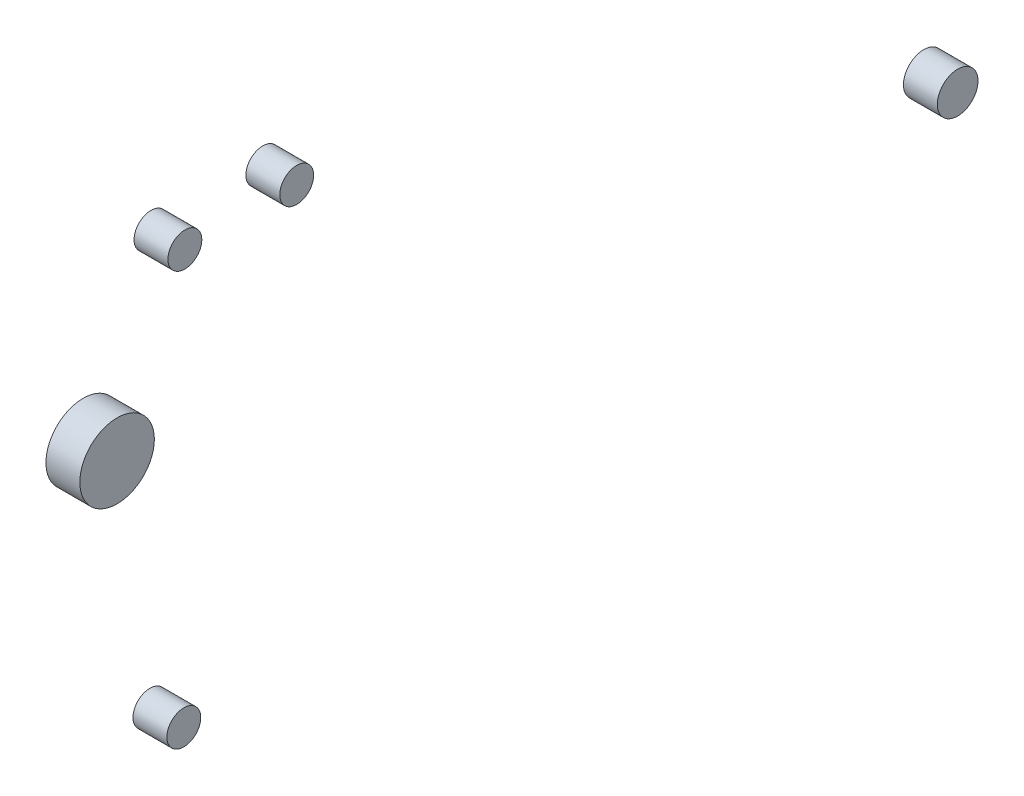
ISO-10303-21;
HEADER;
FILE_DESCRIPTION(('STEP AP214'),'2;1');
FILE_NAME('part.step','',(''),(''),'','','');
FILE_SCHEMA(('AUTOMOTIVE_DESIGN { 1 0 10303 214 1 1 1 1 }'));
ENDSEC;
DATA;
#1=APPLICATION_CONTEXT('core data for automotive mechanical design processes');
#2=APPLICATION_PROTOCOL_DEFINITION('international standard','automotive_design',2000,#1);
#3=PRODUCT_CONTEXT('',#1,'mechanical');
#4=PRODUCT('Part','Part','',(#3));
#5=PRODUCT_RELATED_PRODUCT_CATEGORY('part','',(#4));
#6=PRODUCT_DEFINITION_FORMATION('','',#4);
#7=PRODUCT_DEFINITION_CONTEXT('part definition',#1,'design');
#8=PRODUCT_DEFINITION('design','',#6,#7);
#9=PRODUCT_DEFINITION_SHAPE('','',#8);
#10=(LENGTH_UNIT() NAMED_UNIT(*) SI_UNIT(.MILLI.,.METRE.));
#11=(NAMED_UNIT(*) PLANE_ANGLE_UNIT() SI_UNIT($,.RADIAN.));
#12=(NAMED_UNIT(*) SI_UNIT($,.STERADIAN.) SOLID_ANGLE_UNIT());
#13=UNCERTAINTY_MEASURE_WITH_UNIT(LENGTH_MEASURE(1.E-05),#10,'distance_accuracy_value','');
#14=(GEOMETRIC_REPRESENTATION_CONTEXT(3) GLOBAL_UNCERTAINTY_ASSIGNED_CONTEXT((#13)) GLOBAL_UNIT_ASSIGNED_CONTEXT((#10,
#11,#12)) REPRESENTATION_CONTEXT('',''));
#15=CARTESIAN_POINT('',(0.,0.,0.));
#16=DIRECTION('',(0.,0.,1.));
#17=DIRECTION('',(1.,0.,0.));
#18=AXIS2_PLACEMENT_3D('',#15,#16,#17);
#19=CARTESIAN_POINT('',(2.54,30.976,-8.462));
#20=DIRECTION('',(-1.,0.,0.));
#21=DIRECTION('',(0.,0.,1.));
#22=AXIS2_PLACEMENT_3D('',#19,#20,#21);
#23=CYLINDRICAL_SURFACE('',#22,1.27);
#24=CARTESIAN_POINT('',(2.54,30.976,-8.462));
#25=DIRECTION('',(1.,0.,0.));
#26=DIRECTION('',(0.,0.,-1.));
#27=AXIS2_PLACEMENT_3D('',#24,#25,#26);
#28=CIRCLE('',#27,1.27);
#29=CARTESIAN_POINT('',(2.54,30.976,-9.732));
#30=VERTEX_POINT('',#29);
#31=EDGE_CURVE('E11',#30,#30,#28,.T.);
#32=ORIENTED_EDGE('',*,*,#31,.F.);
#33=EDGE_LOOP('',(#32));
#34=FACE_BOUND('',#33,.T.);
#35=CARTESIAN_POINT('',(0.,30.976,-8.462));
#36=DIRECTION('',(1.,0.,0.));
#37=DIRECTION('',(0.,0.,-1.));
#38=AXIS2_PLACEMENT_3D('',#35,#36,#37);
#39=CIRCLE('',#38,1.27);
#40=CARTESIAN_POINT('',(0.,30.976,-9.732));
#41=VERTEX_POINT('',#40);
#42=EDGE_CURVE('E43',#41,#41,#39,.T.);
#43=ORIENTED_EDGE('',*,*,#42,.T.);
#44=EDGE_LOOP('',(#43));
#45=FACE_BOUND('',#44,.T.);
#46=ADVANCED_FACE('F40',(#34,#45),#23,.T.);
#47=CARTESIAN_POINT('',(2.54,30.976,-8.462));
#48=DIRECTION('',(1.,0.,0.));
#49=DIRECTION('',(0.,0.,-1.));
#50=AXIS2_PLACEMENT_3D('',#47,#48,#49);
#51=PLANE('',#50);
#52=ORIENTED_EDGE('',*,*,#31,.T.);
#53=EDGE_LOOP('',(#52));
#54=FACE_BOUND('',#53,.T.);
#55=ADVANCED_FACE('F55',(#54),#51,.T.);
#56=CARTESIAN_POINT('',(0.,30.976,-8.462));
#57=DIRECTION('',(1.,0.,0.));
#58=DIRECTION('',(0.,0.,-1.));
#59=AXIS2_PLACEMENT_3D('',#56,#57,#58);
#60=PLANE('',#59);
#61=ORIENTED_EDGE('',*,*,#42,.F.);
#62=EDGE_LOOP('',(#61));
#63=FACE_BOUND('',#62,.T.);
#64=ADVANCED_FACE('F53',(#63),#60,.F.);
#65=CLOSED_SHELL('',(#46,#55,#64));
#66=MANIFOLD_SOLID_BREP('B2',#65);
#67=CARTESIAN_POINT('',(2.54,30.976,-0.0799999999999967));
#68=DIRECTION('',(-1.,0.,0.));
#69=DIRECTION('',(0.,0.,1.));
#70=AXIS2_PLACEMENT_3D('',#67,#68,#69);
#71=CYLINDRICAL_SURFACE('',#70,1.27);
#72=CARTESIAN_POINT('',(2.54,30.976,-0.0799999999999967));
#73=DIRECTION('',(1.,0.,0.));
#74=DIRECTION('',(0.,0.,-1.));
#75=AXIS2_PLACEMENT_3D('',#72,#73,#74);
#76=CIRCLE('',#75,1.27);
#77=CARTESIAN_POINT('',(2.54,30.976,-1.35));
#78=VERTEX_POINT('',#77);
#79=EDGE_CURVE('E39',#78,#78,#76,.T.);
#80=ORIENTED_EDGE('',*,*,#79,.F.);
#81=EDGE_LOOP('',(#80));
#82=FACE_BOUND('',#81,.T.);
#83=CARTESIAN_POINT('',(0.,30.976,-0.0799999999999967));
#84=DIRECTION('',(1.,0.,0.));
#85=DIRECTION('',(0.,0.,-1.));
#86=AXIS2_PLACEMENT_3D('',#83,#84,#85);
#87=CIRCLE('',#86,1.27);
#88=CARTESIAN_POINT('',(0.,30.976,-1.35));
#89=VERTEX_POINT('',#88);
#90=EDGE_CURVE('E92',#89,#89,#87,.T.);
#91=ORIENTED_EDGE('',*,*,#90,.T.);
#92=EDGE_LOOP('',(#91));
#93=FACE_BOUND('',#92,.T.);
#94=ADVANCED_FACE('F89',(#82,#93),#71,.T.);
#95=CARTESIAN_POINT('',(2.54,30.976,-0.0799999999999967));
#96=DIRECTION('',(1.,0.,0.));
#97=DIRECTION('',(0.,0.,-1.));
#98=AXIS2_PLACEMENT_3D('',#95,#96,#97);
#99=PLANE('',#98);
#100=ORIENTED_EDGE('',*,*,#79,.T.);
#101=EDGE_LOOP('',(#100));
#102=FACE_BOUND('',#101,.T.);
#103=ADVANCED_FACE('F104',(#102),#99,.T.);
#104=CARTESIAN_POINT('',(0.,30.976,-0.0799999999999967));
#105=DIRECTION('',(1.,0.,0.));
#106=DIRECTION('',(0.,0.,-1.));
#107=AXIS2_PLACEMENT_3D('',#104,#105,#106);
#108=PLANE('',#107);
#109=ORIENTED_EDGE('',*,*,#90,.F.);
#110=EDGE_LOOP('',(#109));
#111=FACE_BOUND('',#110,.T.);
#112=ADVANCED_FACE('F102',(#111),#108,.F.);
#113=CLOSED_SHELL('',(#94,#103,#112));
#114=MANIFOLD_SOLID_BREP('B6',#113);
#115=CARTESIAN_POINT('',(2.54,12.2,-58.));
#116=DIRECTION('',(-1.,0.,0.));
#117=DIRECTION('',(0.,0.,1.));
#118=AXIS2_PLACEMENT_3D('',#115,#116,#117);
#119=CYLINDRICAL_SURFACE('',#118,1.524);
#120=CARTESIAN_POINT('',(2.54,12.2,-58.));
#121=DIRECTION('',(1.,0.,0.));
#122=DIRECTION('',(0.,0.,-1.));
#123=AXIS2_PLACEMENT_3D('',#120,#121,#122);
#124=CIRCLE('',#123,1.524);
#125=CARTESIAN_POINT('',(2.54,12.2,-59.524));
#126=VERTEX_POINT('',#125);
#127=EDGE_CURVE('E88',#126,#126,#124,.T.);
#128=ORIENTED_EDGE('',*,*,#127,.F.);
#129=EDGE_LOOP('',(#128));
#130=FACE_BOUND('',#129,.T.);
#131=CARTESIAN_POINT('',(0.,12.2,-58.));
#132=DIRECTION('',(1.,0.,0.));
#133=DIRECTION('',(0.,0.,-1.));
#134=AXIS2_PLACEMENT_3D('',#131,#132,#133);
#135=CIRCLE('',#134,1.524);
#136=CARTESIAN_POINT('',(0.,12.2,-59.524));
#137=VERTEX_POINT('',#136);
#138=EDGE_CURVE('E141',#137,#137,#135,.T.);
#139=ORIENTED_EDGE('',*,*,#138,.T.);
#140=EDGE_LOOP('',(#139));
#141=FACE_BOUND('',#140,.T.);
#142=ADVANCED_FACE('F138',(#130,#141),#119,.T.);
#143=CARTESIAN_POINT('',(2.54,12.2,-58.));
#144=DIRECTION('',(1.,0.,0.));
#145=DIRECTION('',(0.,0.,-1.));
#146=AXIS2_PLACEMENT_3D('',#143,#144,#145);
#147=PLANE('',#146);
#148=ORIENTED_EDGE('',*,*,#127,.T.);
#149=EDGE_LOOP('',(#148));
#150=FACE_BOUND('',#149,.T.);
#151=ADVANCED_FACE('F153',(#150),#147,.T.);
#152=CARTESIAN_POINT('',(0.,12.2,-58.));
#153=DIRECTION('',(1.,0.,0.));
#154=DIRECTION('',(0.,0.,-1.));
#155=AXIS2_PLACEMENT_3D('',#152,#153,#154);
#156=PLANE('',#155);
#157=ORIENTED_EDGE('',*,*,#138,.F.);
#158=EDGE_LOOP('',(#157));
#159=FACE_BOUND('',#158,.T.);
#160=ADVANCED_FACE('F151',(#159),#156,.F.);
#161=CLOSED_SHELL('',(#142,#151,#160));
#162=MANIFOLD_SOLID_BREP('B34',#161);
#163=CARTESIAN_POINT('',(2.54,19.8,5.));
#164=DIRECTION('',(-1.,0.,0.));
#165=DIRECTION('',(0.,0.,1.));
#166=AXIS2_PLACEMENT_3D('',#163,#164,#165);
#167=CYLINDRICAL_SURFACE('',#166,2.794);
#168=CARTESIAN_POINT('',(2.54,19.8,5.));
#169=DIRECTION('',(1.,0.,0.));
#170=DIRECTION('',(0.,0.,-1.));
#171=AXIS2_PLACEMENT_3D('',#168,#169,#170);
#172=CIRCLE('',#171,2.794);
#173=CARTESIAN_POINT('',(2.54,19.8,2.20599999999999));
#174=VERTEX_POINT('',#173);
#175=EDGE_CURVE('E137',#174,#174,#172,.T.);
#176=ORIENTED_EDGE('',*,*,#175,.F.);
#177=EDGE_LOOP('',(#176));
#178=FACE_BOUND('',#177,.T.);
#179=CARTESIAN_POINT('',(0.,19.8,5.));
#180=DIRECTION('',(1.,0.,0.));
#181=DIRECTION('',(0.,0.,-1.));
#182=AXIS2_PLACEMENT_3D('',#179,#180,#181);
#183=CIRCLE('',#182,2.794);
#184=CARTESIAN_POINT('',(0.,19.8,2.20599999999999));
#185=VERTEX_POINT('',#184);
#186=EDGE_CURVE('E189',#185,#185,#183,.T.);
#187=ORIENTED_EDGE('',*,*,#186,.T.);
#188=EDGE_LOOP('',(#187));
#189=FACE_BOUND('',#188,.T.);
#190=ADVANCED_FACE('F186',(#178,#189),#167,.T.);
#191=CARTESIAN_POINT('',(2.54,19.8,5.));
#192=DIRECTION('',(1.,0.,0.));
#193=DIRECTION('',(0.,0.,-1.));
#194=AXIS2_PLACEMENT_3D('',#191,#192,#193);
#195=PLANE('',#194);
#196=ORIENTED_EDGE('',*,*,#175,.T.);
#197=EDGE_LOOP('',(#196));
#198=FACE_BOUND('',#197,.T.);
#199=ADVANCED_FACE('F201',(#198),#195,.T.);
#200=CARTESIAN_POINT('',(0.,19.8,5.));
#201=DIRECTION('',(1.,0.,0.));
#202=DIRECTION('',(0.,0.,-1.));
#203=AXIS2_PLACEMENT_3D('',#200,#201,#202);
#204=PLANE('',#203);
#205=ORIENTED_EDGE('',*,*,#186,.F.);
#206=EDGE_LOOP('',(#205));
#207=FACE_BOUND('',#206,.T.);
#208=ADVANCED_FACE('F199',(#207),#204,.F.);
#209=CLOSED_SHELL('',(#190,#199,#208));
#210=MANIFOLD_SOLID_BREP('B83',#209);
#211=CARTESIAN_POINT('',(2.54,0.,0.));
#212=DIRECTION('',(-1.,0.,0.));
#213=DIRECTION('',(0.,0.,1.));
#214=AXIS2_PLACEMENT_3D('',#211,#212,#213);
#215=CYLINDRICAL_SURFACE('',#214,1.27);
#216=CARTESIAN_POINT('',(2.54,0.,0.));
#217=DIRECTION('',(1.,0.,0.));
#218=DIRECTION('',(0.,0.,-1.));
#219=AXIS2_PLACEMENT_3D('',#216,#217,#218);
#220=CIRCLE('',#219,1.27);
#221=CARTESIAN_POINT('',(2.54,0.,-1.27));
#222=VERTEX_POINT('',#221);
#223=EDGE_CURVE('E185',#222,#222,#220,.T.);
#224=ORIENTED_EDGE('',*,*,#223,.F.);
#225=EDGE_LOOP('',(#224));
#226=FACE_BOUND('',#225,.T.);
#227=CARTESIAN_POINT('',(0.,0.,0.));
#228=DIRECTION('',(1.,0.,0.));
#229=DIRECTION('',(0.,0.,-1.));
#230=AXIS2_PLACEMENT_3D('',#227,#228,#229);
#231=CIRCLE('',#230,1.27);
#232=CARTESIAN_POINT('',(0.,0.,-1.27));
#233=VERTEX_POINT('',#232);
#234=EDGE_CURVE('E230',#233,#233,#231,.T.);
#235=ORIENTED_EDGE('',*,*,#234,.T.);
#236=EDGE_LOOP('',(#235));
#237=FACE_BOUND('',#236,.T.);
#238=ADVANCED_FACE('F227',(#226,#237),#215,.T.);
#239=CARTESIAN_POINT('',(2.54,0.,0.));
#240=DIRECTION('',(1.,0.,0.));
#241=DIRECTION('',(0.,0.,-1.));
#242=AXIS2_PLACEMENT_3D('',#239,#240,#241);
#243=PLANE('',#242);
#244=ORIENTED_EDGE('',*,*,#223,.T.);
#245=EDGE_LOOP('',(#244));
#246=FACE_BOUND('',#245,.T.);
#247=ADVANCED_FACE('F242',(#246),#243,.T.);
#248=CARTESIAN_POINT('',(0.,0.,0.));
#249=DIRECTION('',(1.,0.,0.));
#250=DIRECTION('',(0.,0.,-1.));
#251=AXIS2_PLACEMENT_3D('',#248,#249,#250);
#252=PLANE('',#251);
#253=ORIENTED_EDGE('',*,*,#234,.F.);
#254=EDGE_LOOP('',(#253));
#255=FACE_BOUND('',#254,.T.);
#256=ADVANCED_FACE('F240',(#255),#252,.F.);
#257=CLOSED_SHELL('',(#238,#247,#256));
#258=MANIFOLD_SOLID_BREP('B132',#257);
#259=ADVANCED_BREP_SHAPE_REPRESENTATION('',(#18,#66,#114,#162,#210,#258),#14);
#260=SHAPE_DEFINITION_REPRESENTATION(#9,#259);
ENDSEC;
END-ISO-10303-21;
